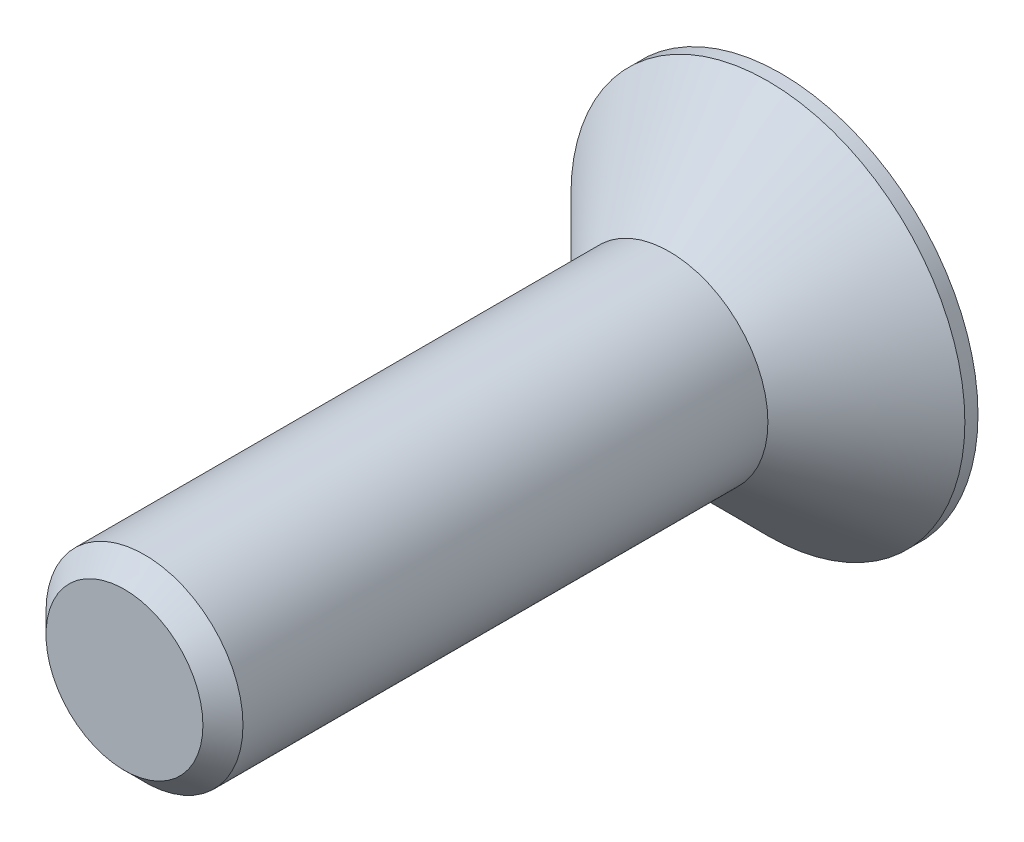
ISO-10303-21;
HEADER;
FILE_DESCRIPTION(('STEP AP214'),'2;1');
FILE_NAME('part.step','',(''),(''),'','','');
FILE_SCHEMA(('AUTOMOTIVE_DESIGN { 1 0 10303 214 1 1 1 1 }'));
ENDSEC;
DATA;
#1=APPLICATION_CONTEXT('core data for automotive mechanical design processes');
#2=APPLICATION_PROTOCOL_DEFINITION('international standard','automotive_design',2000,#1);
#3=PRODUCT_CONTEXT('',#1,'mechanical');
#4=PRODUCT('Part','Part','',(#3));
#5=PRODUCT_RELATED_PRODUCT_CATEGORY('part','',(#4));
#6=PRODUCT_DEFINITION_FORMATION('','',#4);
#7=PRODUCT_DEFINITION_CONTEXT('part definition',#1,'design');
#8=PRODUCT_DEFINITION('design','',#6,#7);
#9=PRODUCT_DEFINITION_SHAPE('','',#8);
#10=(LENGTH_UNIT() NAMED_UNIT(*) SI_UNIT(.MILLI.,.METRE.));
#11=(NAMED_UNIT(*) PLANE_ANGLE_UNIT() SI_UNIT($,.RADIAN.));
#12=(NAMED_UNIT(*) SI_UNIT($,.STERADIAN.) SOLID_ANGLE_UNIT());
#13=UNCERTAINTY_MEASURE_WITH_UNIT(LENGTH_MEASURE(1.E-05),#10,'distance_accuracy_value','');
#14=(GEOMETRIC_REPRESENTATION_CONTEXT(3) GLOBAL_UNCERTAINTY_ASSIGNED_CONTEXT((#13)) GLOBAL_UNIT_ASSIGNED_CONTEXT((#10,
#11,#12)) REPRESENTATION_CONTEXT('',''));
#15=CARTESIAN_POINT('',(0.,0.,0.));
#16=DIRECTION('',(0.,0.,1.));
#17=DIRECTION('',(1.,0.,0.));
#18=AXIS2_PLACEMENT_3D('',#15,#16,#17);
#19=CARTESIAN_POINT('',(0.,0.,-1.7));
#20=DIRECTION('',(0.,0.,1.));
#21=DIRECTION('',(1.,0.,0.));
#22=AXIS2_PLACEMENT_3D('',#19,#20,#21);
#23=CYLINDRICAL_SURFACE('',#22,3.);
#24=CARTESIAN_POINT('',(0.,0.,-1.7));
#25=DIRECTION('',(0.,0.,1.));
#26=DIRECTION('',(1.,0.,0.));
#27=AXIS2_PLACEMENT_3D('',#24,#25,#26);
#28=CIRCLE('',#27,3.);
#29=CARTESIAN_POINT('',(3.,0.,-1.7));
#30=VERTEX_POINT('',#29);
#31=EDGE_CURVE('E129',#30,#30,#28,.T.);
#32=ORIENTED_EDGE('',*,*,#31,.T.);
#33=EDGE_LOOP('',(#32));
#34=FACE_BOUND('',#33,.T.);
#35=CARTESIAN_POINT('',(0.,0.,-1.5));
#36=DIRECTION('',(0.,0.,1.));
#37=DIRECTION('',(1.,0.,0.));
#38=AXIS2_PLACEMENT_3D('',#35,#36,#37);
#39=CIRCLE('',#38,3.);
#40=CARTESIAN_POINT('',(3.,0.,-1.5));
#41=VERTEX_POINT('',#40);
#42=EDGE_CURVE('E118',#41,#41,#39,.T.);
#43=ORIENTED_EDGE('',*,*,#42,.F.);
#44=EDGE_LOOP('',(#43));
#45=FACE_BOUND('',#44,.T.);
#46=ADVANCED_FACE('F16',(#34,#45),#23,.T.);
#47=CARTESIAN_POINT('',(3.,0.,-1.7));
#48=DIRECTION('',(0.,0.,-1.));
#49=DIRECTION('',(-1.,0.,0.));
#50=AXIS2_PLACEMENT_3D('',#47,#48,#49);
#51=PLANE('',#50);
#52=DIRECTION('',(1.,0.,0.));
#53=VECTOR('',#52,1.);
#54=CARTESIAN_POINT('',(-0.577350269189617,1.,-1.7));
#55=LINE('',#54,#53);
#56=CARTESIAN_POINT('',(-0.577350269189617,1.,-1.7));
#57=VERTEX_POINT('',#56);
#58=CARTESIAN_POINT('',(0.577350269189617,1.,-1.7));
#59=VERTEX_POINT('',#58);
#60=EDGE_CURVE('E31',#57,#59,#55,.T.);
#61=ORIENTED_EDGE('',*,*,#60,.F.);
#62=DIRECTION('',(0.5,0.866025403784439,0.));
#63=VECTOR('',#62,1.);
#64=CARTESIAN_POINT('',(-1.15470053837925,0.,-1.7));
#65=LINE('',#64,#63);
#66=CARTESIAN_POINT('',(-1.15470053837925,0.,-1.7));
#67=VERTEX_POINT('',#66);
#68=EDGE_CURVE('E114',#67,#57,#65,.T.);
#69=ORIENTED_EDGE('',*,*,#68,.F.);
#70=DIRECTION('',(-0.5,0.866025403784438,0.));
#71=VECTOR('',#70,1.);
#72=CARTESIAN_POINT('',(-0.577350269189633,-1.,-1.7));
#73=LINE('',#72,#71);
#74=CARTESIAN_POINT('',(-0.577350269189633,-1.,-1.7));
#75=VERTEX_POINT('',#74);
#76=EDGE_CURVE('E112',#75,#67,#73,.T.);
#77=ORIENTED_EDGE('',*,*,#76,.F.);
#78=DIRECTION('',(-1.,0.,0.));
#79=VECTOR('',#78,1.);
#80=CARTESIAN_POINT('',(0.577350269189632,-1.,-1.7));
#81=LINE('',#80,#79);
#82=CARTESIAN_POINT('',(0.577350269189632,-1.,-1.7));
#83=VERTEX_POINT('',#82);
#84=EDGE_CURVE('E79',#83,#75,#81,.T.);
#85=ORIENTED_EDGE('',*,*,#84,.F.);
#86=DIRECTION('',(-0.5,-0.866025403784439,0.));
#87=VECTOR('',#86,1.);
#88=CARTESIAN_POINT('',(1.15470053837925,0.,-1.7));
#89=LINE('',#88,#87);
#90=CARTESIAN_POINT('',(1.15470053837925,0.,-1.7));
#91=VERTEX_POINT('',#90);
#92=EDGE_CURVE('E108',#91,#83,#89,.T.);
#93=ORIENTED_EDGE('',*,*,#92,.F.);
#94=DIRECTION('',(0.5,-0.866025403784438,0.));
#95=VECTOR('',#94,1.);
#96=CARTESIAN_POINT('',(0.577350269189616,1.,-1.7));
#97=LINE('',#96,#95);
#98=EDGE_CURVE('E105',#59,#91,#97,.T.);
#99=ORIENTED_EDGE('',*,*,#98,.F.);
#100=EDGE_LOOP('',(#61,#69,#77,#85,#93,#99));
#101=FACE_BOUND('',#100,.T.);
#102=ORIENTED_EDGE('',*,*,#31,.F.);
#103=EDGE_LOOP('',(#102));
#104=FACE_BOUND('',#103,.T.);
#105=ADVANCED_FACE('F147',(#101,#104),#51,.T.);
#106=CARTESIAN_POINT('',(0.,0.,8.3));
#107=DIRECTION('',(0.,0.,1.));
#108=DIRECTION('',(1.,0.,0.));
#109=AXIS2_PLACEMENT_3D('',#106,#107,#108);
#110=PLANE('',#109);
#111=CARTESIAN_POINT('',(0.,0.,8.3));
#112=DIRECTION('',(0.,0.,1.));
#113=DIRECTION('',(1.,0.,0.));
#114=AXIS2_PLACEMENT_3D('',#111,#112,#113);
#115=CIRCLE('',#114,1.195);
#116=CARTESIAN_POINT('',(1.195,0.,8.3));
#117=VERTEX_POINT('',#116);
#118=EDGE_CURVE('E24',#117,#117,#115,.T.);
#119=ORIENTED_EDGE('',*,*,#118,.T.);
#120=EDGE_LOOP('',(#119));
#121=FACE_BOUND('',#120,.T.);
#122=ADVANCED_FACE('F134',(#121),#110,.T.);
#123=CARTESIAN_POINT('',(0.,0.,-1.7));
#124=DIRECTION('',(0.,0.,1.));
#125=DIRECTION('',(1.,0.,0.));
#126=AXIS2_PLACEMENT_3D('',#123,#124,#125);
#127=CYLINDRICAL_SURFACE('',#126,1.5);
#128=CARTESIAN_POINT('',(0.,0.,7.995));
#129=DIRECTION('',(0.,0.,1.));
#130=DIRECTION('',(1.,0.,0.));
#131=AXIS2_PLACEMENT_3D('',#128,#129,#130);
#132=CIRCLE('',#131,1.5);
#133=CARTESIAN_POINT('',(1.5,0.,7.995));
#134=VERTEX_POINT('',#133);
#135=EDGE_CURVE('E10',#134,#134,#132,.F.);
#136=ORIENTED_EDGE('',*,*,#135,.T.);
#137=EDGE_LOOP('',(#136));
#138=FACE_BOUND('',#137,.T.);
#139=CARTESIAN_POINT('',(0.,0.,0.));
#140=DIRECTION('',(0.,0.,1.));
#141=DIRECTION('',(1.,0.,0.));
#142=AXIS2_PLACEMENT_3D('',#139,#140,#141);
#143=CIRCLE('',#142,1.5);
#144=CARTESIAN_POINT('',(1.5,0.,0.));
#145=VERTEX_POINT('',#144);
#146=EDGE_CURVE('E126',#145,#145,#143,.T.);
#147=ORIENTED_EDGE('',*,*,#146,.T.);
#148=EDGE_LOOP('',(#147));
#149=FACE_BOUND('',#148,.T.);
#150=ADVANCED_FACE('F159',(#138,#149),#127,.T.);
#151=CARTESIAN_POINT('',(0.,0.,0.));
#152=DIRECTION('',(0.,0.,-1.));
#153=DIRECTION('',(-1.,0.,0.));
#154=AXIS2_PLACEMENT_3D('',#151,#152,#153);
#155=CONICAL_SURFACE('',#154,1.5,0.785398163397448);
#156=ORIENTED_EDGE('',*,*,#42,.T.);
#157=EDGE_LOOP('',(#156));
#158=FACE_BOUND('',#157,.T.);
#159=ORIENTED_EDGE('',*,*,#146,.F.);
#160=EDGE_LOOP('',(#159));
#161=FACE_BOUND('',#160,.T.);
#162=ADVANCED_FACE('F162',(#158,#161),#155,.T.);
#163=CARTESIAN_POINT('',(-0.577350269189617,1.,-0.5));
#164=DIRECTION('',(0.,1.,0.));
#165=DIRECTION('',(0.,0.,1.));
#166=AXIS2_PLACEMENT_3D('',#163,#164,#165);
#167=PLANE('',#166);
#168=ORIENTED_EDGE('',*,*,#60,.T.);
#169=DIRECTION('',(0.,0.,-1.));
#170=VECTOR('',#169,1.);
#171=CARTESIAN_POINT('',(0.577350269189616,1.,-0.5));
#172=LINE('',#171,#170);
#173=CARTESIAN_POINT('',(0.577350269189616,1.,-0.5));
#174=VERTEX_POINT('',#173);
#175=EDGE_CURVE('E61',#174,#59,#172,.T.);
#176=ORIENTED_EDGE('',*,*,#175,.F.);
#177=DIRECTION('',(1.,0.,0.));
#178=VECTOR('',#177,1.);
#179=CARTESIAN_POINT('',(-0.577350269189617,1.,-0.5));
#180=LINE('',#179,#178);
#181=CARTESIAN_POINT('',(-0.577350269189617,1.,-0.5));
#182=VERTEX_POINT('',#181);
#183=EDGE_CURVE('E116',#182,#174,#180,.T.);
#184=ORIENTED_EDGE('',*,*,#183,.F.);
#185=DIRECTION('',(0.,0.,-1.));
#186=VECTOR('',#185,1.);
#187=CARTESIAN_POINT('',(-0.577350269189617,1.,-0.5));
#188=LINE('',#187,#186);
#189=EDGE_CURVE('E39',#182,#57,#188,.T.);
#190=ORIENTED_EDGE('',*,*,#189,.T.);
#191=EDGE_LOOP('',(#168,#176,#184,#190));
#192=FACE_BOUND('',#191,.T.);
#193=ADVANCED_FACE('F166',(#192),#167,.F.);
#194=CARTESIAN_POINT('',(-1.15470053837925,0.,-0.5));
#195=DIRECTION('',(-0.866025403784439,0.5,0.));
#196=DIRECTION('',(-0.5,-0.866025403784439,0.));
#197=AXIS2_PLACEMENT_3D('',#194,#195,#196);
#198=PLANE('',#197);
#199=ORIENTED_EDGE('',*,*,#68,.T.);
#200=ORIENTED_EDGE('',*,*,#189,.F.);
#201=DIRECTION('',(0.5,0.866025403784439,0.));
#202=VECTOR('',#201,1.);
#203=CARTESIAN_POINT('',(-1.15470053837925,0.,-0.5));
#204=LINE('',#203,#202);
#205=CARTESIAN_POINT('',(-1.15470053837925,0.,-0.5));
#206=VERTEX_POINT('',#205);
#207=EDGE_CURVE('E91',#206,#182,#204,.T.);
#208=ORIENTED_EDGE('',*,*,#207,.F.);
#209=DIRECTION('',(0.,0.,-1.));
#210=VECTOR('',#209,1.);
#211=CARTESIAN_POINT('',(-1.15470053837925,0.,-0.5));
#212=LINE('',#211,#210);
#213=EDGE_CURVE('E83',#206,#67,#212,.T.);
#214=ORIENTED_EDGE('',*,*,#213,.T.);
#215=EDGE_LOOP('',(#199,#200,#208,#214));
#216=FACE_BOUND('',#215,.T.);
#217=ADVANCED_FACE('F170',(#216),#198,.F.);
#218=CARTESIAN_POINT('',(-0.577350269189633,-1.,-0.5));
#219=DIRECTION('',(-0.866025403784438,-0.5,0.));
#220=DIRECTION('',(0.5,-0.866025403784438,0.));
#221=AXIS2_PLACEMENT_3D('',#218,#219,#220);
#222=PLANE('',#221);
#223=ORIENTED_EDGE('',*,*,#76,.T.);
#224=ORIENTED_EDGE('',*,*,#213,.F.);
#225=DIRECTION('',(-0.5,0.866025403784438,0.));
#226=VECTOR('',#225,1.);
#227=CARTESIAN_POINT('',(-0.577350269189633,-1.,-0.5));
#228=LINE('',#227,#226);
#229=CARTESIAN_POINT('',(-0.577350269189633,-1.,-0.5));
#230=VERTEX_POINT('',#229);
#231=EDGE_CURVE('E87',#230,#206,#228,.T.);
#232=ORIENTED_EDGE('',*,*,#231,.F.);
#233=DIRECTION('',(0.,0.,-1.));
#234=VECTOR('',#233,1.);
#235=CARTESIAN_POINT('',(-0.577350269189633,-1.,-0.5));
#236=LINE('',#235,#234);
#237=EDGE_CURVE('E72',#230,#75,#236,.T.);
#238=ORIENTED_EDGE('',*,*,#237,.T.);
#239=EDGE_LOOP('',(#223,#224,#232,#238));
#240=FACE_BOUND('',#239,.T.);
#241=ADVANCED_FACE('F88',(#240),#222,.F.);
#242=CARTESIAN_POINT('',(0.577350269189632,-1.,-0.5));
#243=DIRECTION('',(0.,-1.,0.));
#244=DIRECTION('',(0.,0.,-1.));
#245=AXIS2_PLACEMENT_3D('',#242,#243,#244);
#246=PLANE('',#245);
#247=ORIENTED_EDGE('',*,*,#84,.T.);
#248=ORIENTED_EDGE('',*,*,#237,.F.);
#249=DIRECTION('',(-1.,0.,0.));
#250=VECTOR('',#249,1.);
#251=CARTESIAN_POINT('',(0.577350269189632,-1.,-0.5));
#252=LINE('',#251,#250);
#253=CARTESIAN_POINT('',(0.577350269189632,-1.,-0.5));
#254=VERTEX_POINT('',#253);
#255=EDGE_CURVE('E76',#254,#230,#252,.T.);
#256=ORIENTED_EDGE('',*,*,#255,.F.);
#257=DIRECTION('',(0.,0.,-1.));
#258=VECTOR('',#257,1.);
#259=CARTESIAN_POINT('',(0.577350269189632,-1.,-0.5));
#260=LINE('',#259,#258);
#261=EDGE_CURVE('E84',#254,#83,#260,.T.);
#262=ORIENTED_EDGE('',*,*,#261,.T.);
#263=EDGE_LOOP('',(#247,#248,#256,#262));
#264=FACE_BOUND('',#263,.T.);
#265=ADVANCED_FACE('F74',(#264),#246,.F.);
#266=CARTESIAN_POINT('',(1.15470053837925,0.,-0.5));
#267=DIRECTION('',(0.866025403784439,-0.5,0.));
#268=DIRECTION('',(0.5,0.866025403784439,0.));
#269=AXIS2_PLACEMENT_3D('',#266,#267,#268);
#270=PLANE('',#269);
#271=ORIENTED_EDGE('',*,*,#92,.T.);
#272=ORIENTED_EDGE('',*,*,#261,.F.);
#273=DIRECTION('',(-0.5,-0.866025403784439,0.));
#274=VECTOR('',#273,1.);
#275=CARTESIAN_POINT('',(1.15470053837925,0.,-0.5));
#276=LINE('',#275,#274);
#277=CARTESIAN_POINT('',(1.15470053837925,0.,-0.5));
#278=VERTEX_POINT('',#277);
#279=EDGE_CURVE('E97',#278,#254,#276,.T.);
#280=ORIENTED_EDGE('',*,*,#279,.F.);
#281=DIRECTION('',(0.,0.,-1.));
#282=VECTOR('',#281,1.);
#283=CARTESIAN_POINT('',(1.15470053837925,0.,-0.5));
#284=LINE('',#283,#282);
#285=EDGE_CURVE('E121',#278,#91,#284,.T.);
#286=ORIENTED_EDGE('',*,*,#285,.T.);
#287=EDGE_LOOP('',(#271,#272,#280,#286));
#288=FACE_BOUND('',#287,.T.);
#289=ADVANCED_FACE('F173',(#288),#270,.F.);
#290=CARTESIAN_POINT('',(0.577350269189616,1.,-0.5));
#291=DIRECTION('',(0.866025403784438,0.5,0.));
#292=DIRECTION('',(-0.5,0.866025403784438,0.));
#293=AXIS2_PLACEMENT_3D('',#290,#291,#292);
#294=PLANE('',#293);
#295=ORIENTED_EDGE('',*,*,#98,.T.);
#296=ORIENTED_EDGE('',*,*,#285,.F.);
#297=DIRECTION('',(0.5,-0.866025403784438,0.));
#298=VECTOR('',#297,1.);
#299=CARTESIAN_POINT('',(0.577350269189616,1.,-0.5));
#300=LINE('',#299,#298);
#301=EDGE_CURVE('E99',#174,#278,#300,.T.);
#302=ORIENTED_EDGE('',*,*,#301,.F.);
#303=ORIENTED_EDGE('',*,*,#175,.T.);
#304=EDGE_LOOP('',(#295,#296,#302,#303));
#305=FACE_BOUND('',#304,.T.);
#306=ADVANCED_FACE('F143',(#305),#294,.F.);
#307=CARTESIAN_POINT('',(0.577350269189616,1.,-0.5));
#308=DIRECTION('',(0.,0.,-1.));
#309=DIRECTION('',(-1.,0.,0.));
#310=AXIS2_PLACEMENT_3D('',#307,#308,#309);
#311=PLANE('',#310);
#312=ORIENTED_EDGE('',*,*,#183,.T.);
#313=ORIENTED_EDGE('',*,*,#301,.T.);
#314=ORIENTED_EDGE('',*,*,#279,.T.);
#315=ORIENTED_EDGE('',*,*,#255,.T.);
#316=ORIENTED_EDGE('',*,*,#231,.T.);
#317=ORIENTED_EDGE('',*,*,#207,.T.);
#318=EDGE_LOOP('',(#312,#313,#314,#315,#316,#317));
#319=FACE_BOUND('',#318,.T.);
#320=ADVANCED_FACE('F94',(#319),#311,.T.);
#321=CARTESIAN_POINT('',(0.,0.,8.3));
#322=DIRECTION('',(0.,0.,-1.));
#323=DIRECTION('',(-1.,0.,0.));
#324=AXIS2_PLACEMENT_3D('',#321,#322,#323);
#325=CONICAL_SURFACE('',#324,1.195,0.785398163397455);
#326=ORIENTED_EDGE('',*,*,#135,.F.);
#327=EDGE_LOOP('',(#326));
#328=FACE_BOUND('',#327,.T.);
#329=ORIENTED_EDGE('',*,*,#118,.F.);
#330=EDGE_LOOP('',(#329));
#331=FACE_BOUND('',#330,.T.);
#332=ADVANCED_FACE('F18',(#328,#331),#325,.T.);
#333=CLOSED_SHELL('',(#46,#105,#122,#150,#162,#193,#217,#241,#265,#289,#306,#320,#332));
#334=MANIFOLD_SOLID_BREP('B1',#333);
#335=ADVANCED_BREP_SHAPE_REPRESENTATION('',(#18,#334),#14);
#336=SHAPE_DEFINITION_REPRESENTATION(#9,#335);
ENDSEC;
END-ISO-10303-21;
